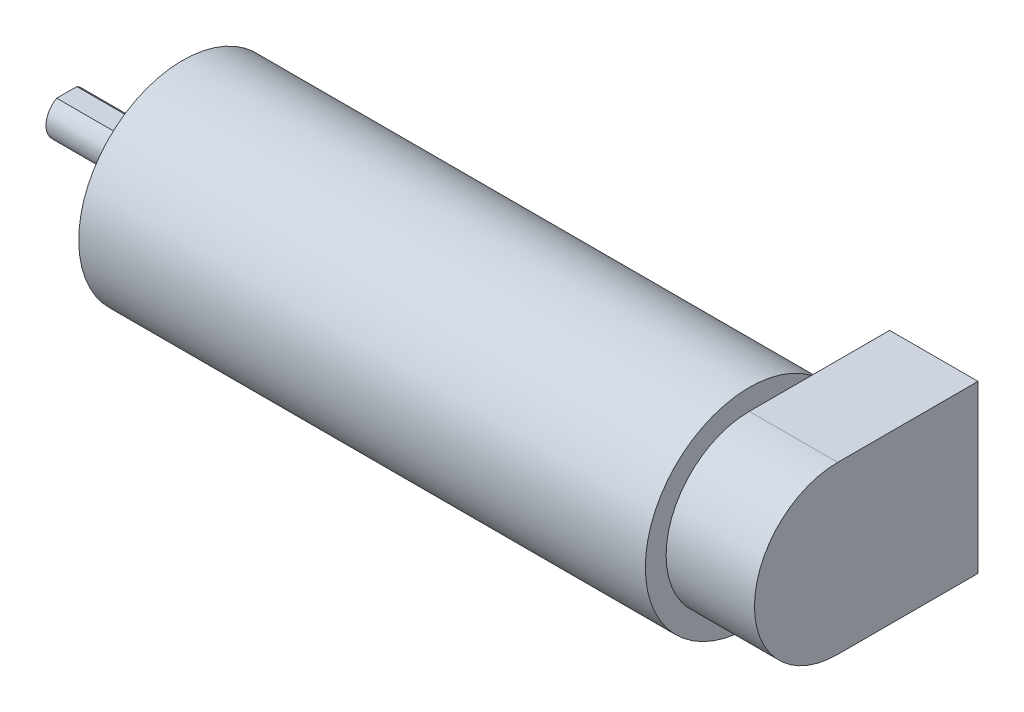
ISO-10303-21;
HEADER;
FILE_DESCRIPTION(('STEP AP214'),'2;1');
FILE_NAME('part.step','',(''),(''),'','','');
FILE_SCHEMA(('AUTOMOTIVE_DESIGN { 1 0 10303 214 1 1 1 1 }'));
ENDSEC;
DATA;
#1=APPLICATION_CONTEXT('core data for automotive mechanical design processes');
#2=APPLICATION_PROTOCOL_DEFINITION('international standard','automotive_design',2000,#1);
#3=PRODUCT_CONTEXT('',#1,'mechanical');
#4=PRODUCT('Part','Part','',(#3));
#5=PRODUCT_RELATED_PRODUCT_CATEGORY('part','',(#4));
#6=PRODUCT_DEFINITION_FORMATION('','',#4);
#7=PRODUCT_DEFINITION_CONTEXT('part definition',#1,'design');
#8=PRODUCT_DEFINITION('design','',#6,#7);
#9=PRODUCT_DEFINITION_SHAPE('','',#8);
#10=(LENGTH_UNIT() NAMED_UNIT(*) SI_UNIT(.MILLI.,.METRE.));
#11=(NAMED_UNIT(*) PLANE_ANGLE_UNIT() SI_UNIT($,.RADIAN.));
#12=(NAMED_UNIT(*) SI_UNIT($,.STERADIAN.) SOLID_ANGLE_UNIT());
#13=UNCERTAINTY_MEASURE_WITH_UNIT(LENGTH_MEASURE(1.E-05),#10,'distance_accuracy_value','');
#14=(GEOMETRIC_REPRESENTATION_CONTEXT(3) GLOBAL_UNCERTAINTY_ASSIGNED_CONTEXT((#13)) GLOBAL_UNIT_ASSIGNED_CONTEXT((#10,
#11,#12)) REPRESENTATION_CONTEXT('',''));
#15=CARTESIAN_POINT('',(0.,0.,0.));
#16=DIRECTION('',(0.,0.,1.));
#17=DIRECTION('',(1.,0.,0.));
#18=AXIS2_PLACEMENT_3D('',#15,#16,#17);
#19=CARTESIAN_POINT('',(-22.3,0.,0.));
#20=DIRECTION('',(0.999999999999999,0.,0.));
#21=DIRECTION('',(0.,0.,-0.999999999999999));
#22=AXIS2_PLACEMENT_3D('',#19,#20,#21);
#23=CYLINDRICAL_SURFACE('',#22,4.);
#24=CARTESIAN_POINT('',(-3.3,0.,0.));
#25=DIRECTION('',(-0.999999999999999,0.,0.));
#26=DIRECTION('',(0.,0.,0.999999999999999));
#27=AXIS2_PLACEMENT_3D('',#24,#25,#26);
#28=CIRCLE('',#27,4.);
#29=CARTESIAN_POINT('',(-3.3,0.,4.));
#30=VERTEX_POINT('',#29);
#31=EDGE_CURVE('E110',#30,#30,#28,.T.);
#32=ORIENTED_EDGE('',*,*,#31,.T.);
#33=EDGE_LOOP('',(#32));
#34=FACE_BOUND('',#33,.T.);
#35=DIRECTION('',(-1.,0.,0.));
#36=VECTOR('',#35,1.);
#37=CARTESIAN_POINT('',(-7.3,3.49999999999999,1.93649167310372));
#38=LINE('',#37,#36);
#39=CARTESIAN_POINT('',(-7.3,3.49999999999999,1.93649167310372));
#40=VERTEX_POINT('',#39);
#41=CARTESIAN_POINT('',(-22.3,3.49999999999999,1.93649167310372));
#42=VERTEX_POINT('',#41);
#43=EDGE_CURVE('E92',#40,#42,#38,.T.);
#44=ORIENTED_EDGE('',*,*,#43,.T.);
#45=CARTESIAN_POINT('',(-22.3,0.,0.));
#46=DIRECTION('',(-0.999999999999999,0.,0.));
#47=DIRECTION('',(0.,0.,0.999999999999999));
#48=AXIS2_PLACEMENT_3D('',#45,#46,#47);
#49=CIRCLE('',#48,4.);
#50=CARTESIAN_POINT('',(-22.3,3.50000000000001,-1.9364916731037));
#51=VERTEX_POINT('',#50);
#52=EDGE_CURVE('E112',#51,#42,#49,.T.);
#53=ORIENTED_EDGE('',*,*,#52,.F.);
#54=DIRECTION('',(-1.,0.,0.));
#55=VECTOR('',#54,1.);
#56=CARTESIAN_POINT('',(-7.3,3.50000000000001,-1.9364916731037));
#57=LINE('',#56,#55);
#58=CARTESIAN_POINT('',(-7.3,3.50000000000001,-1.9364916731037));
#59=VERTEX_POINT('',#58);
#60=EDGE_CURVE('E50',#59,#51,#57,.T.);
#61=ORIENTED_EDGE('',*,*,#60,.F.);
#62=CARTESIAN_POINT('',(-7.3,0.,0.));
#63=DIRECTION('',(-1.,0.,0.));
#64=DIRECTION('',(0.,0.,1.));
#65=AXIS2_PLACEMENT_3D('',#62,#63,#64);
#66=CIRCLE('',#65,4.);
#67=EDGE_CURVE('E102',#40,#59,#66,.T.);
#68=ORIENTED_EDGE('',*,*,#67,.F.);
#69=EDGE_LOOP('',(#44,#53,#61,#68));
#70=FACE_BOUND('',#69,.T.);
#71=ADVANCED_FACE('F35',(#34,#70),#23,.T.);
#72=CARTESIAN_POINT('',(-22.3,0.,0.));
#73=DIRECTION('',(-0.999999999999999,0.,0.));
#74=DIRECTION('',(0.,0.,0.999999999999999));
#75=AXIS2_PLACEMENT_3D('',#72,#73,#74);
#76=PLANE('',#75);
#77=ORIENTED_EDGE('',*,*,#52,.T.);
#78=DIRECTION('',(0.,0.,-1.));
#79=VECTOR('',#78,1.);
#80=CARTESIAN_POINT('',(-22.3,3.5,0.));
#81=LINE('',#80,#79);
#82=EDGE_CURVE('E97',#42,#51,#81,.T.);
#83=ORIENTED_EDGE('',*,*,#82,.T.);
#84=EDGE_LOOP('',(#77,#83));
#85=FACE_BOUND('',#84,.T.);
#86=ADVANCED_FACE('F179',(#85),#76,.T.);
#87=CARTESIAN_POINT('',(109.,-4.44089209850063E-13,0.));
#88=DIRECTION('',(-0.999999999999999,0.,0.));
#89=DIRECTION('',(0.,0.,0.999999999999999));
#90=AXIS2_PLACEMENT_3D('',#87,#88,#89);
#91=CYLINDRICAL_SURFACE('',#90,20.);
#92=CARTESIAN_POINT('',(109.,-4.44089209850063E-13,0.));
#93=DIRECTION('',(0.999999999999999,0.,0.));
#94=DIRECTION('',(0.,0.,-0.999999999999999));
#95=AXIS2_PLACEMENT_3D('',#92,#93,#94);
#96=CIRCLE('',#95,20.);
#97=CARTESIAN_POINT('',(109.,16.,-11.9999999999999));
#98=VERTEX_POINT('',#97);
#99=CARTESIAN_POINT('',(109.,-16.0000000000003,-11.9999999999999));
#100=VERTEX_POINT('',#99);
#101=EDGE_CURVE('E151',#98,#100,#96,.T.);
#102=ORIENTED_EDGE('',*,*,#101,.F.);
#103=EDGE_CURVE('E152',#100,#98,#96,.T.);
#104=ORIENTED_EDGE('',*,*,#103,.F.);
#105=EDGE_LOOP('',(#102,#104));
#106=FACE_BOUND('',#105,.T.);
#107=CARTESIAN_POINT('',(0.,0.,0.));
#108=DIRECTION('',(0.999999999999999,0.,0.));
#109=DIRECTION('',(0.,0.,-0.999999999999999));
#110=AXIS2_PLACEMENT_3D('',#107,#108,#109);
#111=CIRCLE('',#110,20.);
#112=CARTESIAN_POINT('',(0.,0.,-20.));
#113=VERTEX_POINT('',#112);
#114=EDGE_CURVE('E150',#113,#113,#111,.T.);
#115=ORIENTED_EDGE('',*,*,#114,.T.);
#116=EDGE_LOOP('',(#115));
#117=FACE_BOUND('',#116,.T.);
#118=ADVANCED_FACE('F37',(#106,#117),#91,.T.);
#119=CARTESIAN_POINT('',(109.,-4.44089209850063E-13,0.));
#120=DIRECTION('',(0.999999999999999,0.,0.));
#121=DIRECTION('',(0.,0.,-0.999999999999999));
#122=AXIS2_PLACEMENT_3D('',#119,#120,#121);
#123=PLANE('',#122);
#124=DIRECTION('',(0.,0.,0.999999999999999));
#125=VECTOR('',#124,1.);
#126=CARTESIAN_POINT('',(109.,16.,0.));
#127=LINE('',#126,#125);
#128=CARTESIAN_POINT('',(109.,16.,0.));
#129=VERTEX_POINT('',#128);
#130=EDGE_CURVE('E43',#98,#129,#127,.T.);
#131=ORIENTED_EDGE('',*,*,#130,.F.);
#132=ORIENTED_EDGE('',*,*,#101,.T.);
#133=DIRECTION('',(0.,0.,-0.999999999999999));
#134=VECTOR('',#133,1.);
#135=CARTESIAN_POINT('',(109.,-16.0000000000002,0.));
#136=LINE('',#135,#134);
#137=CARTESIAN_POINT('',(109.,-16.0000000000002,0.));
#138=VERTEX_POINT('',#137);
#139=EDGE_CURVE('E132',#138,#100,#136,.T.);
#140=ORIENTED_EDGE('',*,*,#139,.F.);
#141=CARTESIAN_POINT('',(109.,-4.44089209850063E-13,0.));
#142=DIRECTION('',(0.999999999999999,0.,0.));
#143=DIRECTION('',(0.,0.,-0.999999999999999));
#144=AXIS2_PLACEMENT_3D('',#141,#142,#143);
#145=CIRCLE('',#144,16.);
#146=EDGE_CURVE('E58',#129,#138,#145,.T.);
#147=ORIENTED_EDGE('',*,*,#146,.F.);
#148=EDGE_LOOP('',(#131,#132,#140,#147));
#149=FACE_BOUND('',#148,.T.);
#150=ADVANCED_FACE('F177',(#149),#123,.T.);
#151=CARTESIAN_POINT('',(0.,0.,0.));
#152=DIRECTION('',(0.999999999999999,0.,0.));
#153=DIRECTION('',(0.,0.,-0.999999999999999));
#154=AXIS2_PLACEMENT_3D('',#151,#152,#153);
#155=PLANE('',#154);
#156=CARTESIAN_POINT('',(0.,0.,0.));
#157=DIRECTION('',(0.999999999999999,0.,0.));
#158=DIRECTION('',(0.,0.,-0.999999999999999));
#159=AXIS2_PLACEMENT_3D('',#156,#157,#158);
#160=CIRCLE('',#159,12.5);
#161=CARTESIAN_POINT('',(0.,0.,-12.5));
#162=VERTEX_POINT('',#161);
#163=EDGE_CURVE('E11',#162,#162,#160,.F.);
#164=ORIENTED_EDGE('',*,*,#163,.F.);
#165=EDGE_LOOP('',(#164));
#166=FACE_BOUND('',#165,.T.);
#167=ORIENTED_EDGE('',*,*,#114,.F.);
#168=EDGE_LOOP('',(#167));
#169=FACE_BOUND('',#168,.T.);
#170=ADVANCED_FACE('F183',(#166,#169),#155,.F.);
#171=CARTESIAN_POINT('',(109.,-4.44089209850063E-13,0.));
#172=DIRECTION('',(0.999999999999999,0.,0.));
#173=DIRECTION('',(0.,0.,-0.999999999999999));
#174=AXIS2_PLACEMENT_3D('',#171,#172,#173);
#175=PLANE('',#174);
#176=CARTESIAN_POINT('',(109.,-16.,-27.));
#177=VERTEX_POINT('',#176);
#178=EDGE_CURVE('E131',#100,#177,#136,.T.);
#179=ORIENTED_EDGE('',*,*,#178,.F.);
#180=ORIENTED_EDGE('',*,*,#103,.T.);
#181=CARTESIAN_POINT('',(109.,16.,-26.9999999999999));
#182=VERTEX_POINT('',#181);
#183=EDGE_CURVE('E123',#182,#98,#127,.T.);
#184=ORIENTED_EDGE('',*,*,#183,.F.);
#185=DIRECTION('',(0.,1.,0.));
#186=VECTOR('',#185,1.);
#187=CARTESIAN_POINT('',(109.,16.,-26.9999999999999));
#188=LINE('',#187,#186);
#189=EDGE_CURVE('E135',#177,#182,#188,.T.);
#190=ORIENTED_EDGE('',*,*,#189,.F.);
#191=EDGE_LOOP('',(#179,#180,#184,#190));
#192=FACE_BOUND('',#191,.T.);
#193=ADVANCED_FACE('F161',(#192),#175,.F.);
#194=CARTESIAN_POINT('',(126.,-4.44089209850063E-13,0.));
#195=DIRECTION('',(-0.999999999999999,0.,0.));
#196=DIRECTION('',(0.,0.,0.999999999999999));
#197=AXIS2_PLACEMENT_3D('',#194,#195,#196);
#198=CYLINDRICAL_SURFACE('',#197,16.);
#199=ORIENTED_EDGE('',*,*,#146,.T.);
#200=DIRECTION('',(-0.999999999999999,0.,0.));
#201=VECTOR('',#200,1.);
#202=CARTESIAN_POINT('',(126.,-16.0000000000002,0.));
#203=LINE('',#202,#201);
#204=CARTESIAN_POINT('',(126.,-16.0000000000002,0.));
#205=VERTEX_POINT('',#204);
#206=EDGE_CURVE('E147',#205,#138,#203,.T.);
#207=ORIENTED_EDGE('',*,*,#206,.F.);
#208=CARTESIAN_POINT('',(126.,-4.44089209850063E-13,0.));
#209=DIRECTION('',(0.999999999999999,0.,0.));
#210=DIRECTION('',(0.,0.,-0.999999999999999));
#211=AXIS2_PLACEMENT_3D('',#208,#209,#210);
#212=CIRCLE('',#211,16.);
#213=CARTESIAN_POINT('',(126.,15.9999999999996,0.));
#214=VERTEX_POINT('',#213);
#215=EDGE_CURVE('E119',#214,#205,#212,.T.);
#216=ORIENTED_EDGE('',*,*,#215,.F.);
#217=DIRECTION('',(-0.999999999999999,0.,0.));
#218=VECTOR('',#217,1.);
#219=CARTESIAN_POINT('',(126.,15.9999999999996,0.));
#220=LINE('',#219,#218);
#221=EDGE_CURVE('E129',#214,#129,#220,.T.);
#222=ORIENTED_EDGE('',*,*,#221,.T.);
#223=EDGE_LOOP('',(#199,#207,#216,#222));
#224=FACE_BOUND('',#223,.T.);
#225=ADVANCED_FACE('F210',(#224),#198,.T.);
#226=CARTESIAN_POINT('',(126.,-16.0000000000002,0.));
#227=DIRECTION('',(0.,1.,0.));
#228=DIRECTION('',(0.,0.,0.999999999999999));
#229=AXIS2_PLACEMENT_3D('',#226,#227,#228);
#230=PLANE('',#229);
#231=ORIENTED_EDGE('',*,*,#139,.T.);
#232=ORIENTED_EDGE('',*,*,#178,.T.);
#233=DIRECTION('',(-0.999999999999999,0.,0.));
#234=VECTOR('',#233,1.);
#235=CARTESIAN_POINT('',(126.,-16.,-27.));
#236=LINE('',#235,#234);
#237=CARTESIAN_POINT('',(126.,-16.,-27.));
#238=VERTEX_POINT('',#237);
#239=EDGE_CURVE('E144',#238,#177,#236,.T.);
#240=ORIENTED_EDGE('',*,*,#239,.F.);
#241=DIRECTION('',(0.,0.,-0.999999999999999));
#242=VECTOR('',#241,1.);
#243=CARTESIAN_POINT('',(126.,-16.0000000000002,0.));
#244=LINE('',#243,#242);
#245=EDGE_CURVE('E122',#205,#238,#244,.T.);
#246=ORIENTED_EDGE('',*,*,#245,.F.);
#247=ORIENTED_EDGE('',*,*,#206,.T.);
#248=EDGE_LOOP('',(#231,#232,#240,#246,#247));
#249=FACE_BOUND('',#248,.T.);
#250=ADVANCED_FACE('F175',(#249),#230,.F.);
#251=CARTESIAN_POINT('',(126.,15.9999999999999,-26.9999999999999));
#252=DIRECTION('',(0.,0.,0.999999999999999));
#253=DIRECTION('',(0.,-1.,0.));
#254=AXIS2_PLACEMENT_3D('',#251,#252,#253);
#255=PLANE('',#254);
#256=ORIENTED_EDGE('',*,*,#189,.T.);
#257=DIRECTION('',(-0.999999999999999,0.,0.));
#258=VECTOR('',#257,1.);
#259=CARTESIAN_POINT('',(126.,15.9999999999999,-26.9999999999999));
#260=LINE('',#259,#258);
#261=CARTESIAN_POINT('',(126.,15.9999999999999,-26.9999999999999));
#262=VERTEX_POINT('',#261);
#263=EDGE_CURVE('E141',#262,#182,#260,.T.);
#264=ORIENTED_EDGE('',*,*,#263,.F.);
#265=DIRECTION('',(0.,1.,0.));
#266=VECTOR('',#265,1.);
#267=CARTESIAN_POINT('',(126.,15.9999999999999,-26.9999999999999));
#268=LINE('',#267,#266);
#269=EDGE_CURVE('E125',#238,#262,#268,.T.);
#270=ORIENTED_EDGE('',*,*,#269,.F.);
#271=ORIENTED_EDGE('',*,*,#239,.T.);
#272=EDGE_LOOP('',(#256,#264,#270,#271));
#273=FACE_BOUND('',#272,.T.);
#274=ADVANCED_FACE('F172',(#273),#255,.F.);
#275=CARTESIAN_POINT('',(126.,15.9999999999996,0.));
#276=DIRECTION('',(0.,-1.,0.));
#277=DIRECTION('',(0.,0.,-0.999999999999999));
#278=AXIS2_PLACEMENT_3D('',#275,#276,#277);
#279=PLANE('',#278);
#280=ORIENTED_EDGE('',*,*,#183,.T.);
#281=ORIENTED_EDGE('',*,*,#130,.T.);
#282=ORIENTED_EDGE('',*,*,#221,.F.);
#283=DIRECTION('',(0.,0.,0.999999999999999));
#284=VECTOR('',#283,1.);
#285=CARTESIAN_POINT('',(126.,15.9999999999996,0.));
#286=LINE('',#285,#284);
#287=EDGE_CURVE('E127',#262,#214,#286,.T.);
#288=ORIENTED_EDGE('',*,*,#287,.F.);
#289=ORIENTED_EDGE('',*,*,#263,.T.);
#290=EDGE_LOOP('',(#280,#281,#282,#288,#289));
#291=FACE_BOUND('',#290,.T.);
#292=ADVANCED_FACE('F166',(#291),#279,.F.);
#293=CARTESIAN_POINT('',(126.,-4.44089209850063E-13,0.));
#294=DIRECTION('',(0.999999999999999,0.,0.));
#295=DIRECTION('',(0.,0.,-0.999999999999999));
#296=AXIS2_PLACEMENT_3D('',#293,#294,#295);
#297=PLANE('',#296);
#298=ORIENTED_EDGE('',*,*,#215,.T.);
#299=ORIENTED_EDGE('',*,*,#245,.T.);
#300=ORIENTED_EDGE('',*,*,#269,.T.);
#301=ORIENTED_EDGE('',*,*,#287,.T.);
#302=EDGE_LOOP('',(#298,#299,#300,#301));
#303=FACE_BOUND('',#302,.T.);
#304=ADVANCED_FACE('F203',(#303),#297,.T.);
#305=CARTESIAN_POINT('',(-3.3,0.,0.));
#306=DIRECTION('',(0.999999999999999,0.,0.));
#307=DIRECTION('',(0.,0.,-0.999999999999999));
#308=AXIS2_PLACEMENT_3D('',#305,#306,#307);
#309=CYLINDRICAL_SURFACE('',#308,12.5);
#310=CARTESIAN_POINT('',(-3.3,0.,0.));
#311=DIRECTION('',(-0.999999999999999,0.,0.));
#312=DIRECTION('',(0.,0.,0.999999999999999));
#313=AXIS2_PLACEMENT_3D('',#310,#311,#312);
#314=CIRCLE('',#313,12.5);
#315=CARTESIAN_POINT('',(-3.3,0.,-12.5));
#316=VERTEX_POINT('',#315);
#317=EDGE_CURVE('E114',#316,#316,#314,.T.);
#318=CARTESIAN_POINT('',(-3.3,0.,-12.5));
#319=CARTESIAN_POINT('',(-3.265625,0.,-12.5));
#320=CARTESIAN_POINT('',(-3.23125,0.,-12.5));
#321=CARTESIAN_POINT('',(-3.1625,0.,-12.5));
#322=CARTESIAN_POINT('',(-3.128125,0.,-12.5));
#323=CARTESIAN_POINT('',(-3.059375,0.,-12.5));
#324=CARTESIAN_POINT('',(-3.025,0.,-12.5));
#325=CARTESIAN_POINT('',(-2.95625,0.,-12.5));
#326=CARTESIAN_POINT('',(-2.921875,0.,-12.5));
#327=CARTESIAN_POINT('',(-2.853125,0.,-12.5));
#328=CARTESIAN_POINT('',(-2.81875,0.,-12.5));
#329=CARTESIAN_POINT('',(-2.75,0.,-12.5));
#330=CARTESIAN_POINT('',(-2.715625,0.,-12.5));
#331=CARTESIAN_POINT('',(-2.646875,0.,-12.5));
#332=CARTESIAN_POINT('',(-2.6125,0.,-12.5));
#333=CARTESIAN_POINT('',(-2.54375,0.,-12.5));
#334=CARTESIAN_POINT('',(-2.509375,0.,-12.5));
#335=CARTESIAN_POINT('',(-2.440625,0.,-12.5));
#336=CARTESIAN_POINT('',(-2.40625,0.,-12.5));
#337=CARTESIAN_POINT('',(-2.3375,0.,-12.5));
#338=CARTESIAN_POINT('',(-2.303125,0.,-12.5));
#339=CARTESIAN_POINT('',(-2.234375,0.,-12.5));
#340=CARTESIAN_POINT('',(-2.2,0.,-12.5));
#341=CARTESIAN_POINT('',(-2.13125,0.,-12.5));
#342=CARTESIAN_POINT('',(-2.096875,0.,-12.5));
#343=CARTESIAN_POINT('',(-2.028125,0.,-12.5));
#344=CARTESIAN_POINT('',(-1.99375,0.,-12.5));
#345=CARTESIAN_POINT('',(-1.925,0.,-12.5));
#346=CARTESIAN_POINT('',(-1.890625,0.,-12.5));
#347=CARTESIAN_POINT('',(-1.821875,0.,-12.5));
#348=CARTESIAN_POINT('',(-1.7875,0.,-12.5));
#349=CARTESIAN_POINT('',(-1.71875,0.,-12.5));
#350=CARTESIAN_POINT('',(-1.684375,0.,-12.5));
#351=CARTESIAN_POINT('',(-1.615625,0.,-12.5));
#352=CARTESIAN_POINT('',(-1.58125,0.,-12.5));
#353=CARTESIAN_POINT('',(-1.5125,0.,-12.5));
#354=CARTESIAN_POINT('',(-1.478125,0.,-12.5));
#355=CARTESIAN_POINT('',(-1.409375,0.,-12.5));
#356=CARTESIAN_POINT('',(-1.375,0.,-12.5));
#357=CARTESIAN_POINT('',(-1.30625,0.,-12.5));
#358=CARTESIAN_POINT('',(-1.271875,0.,-12.5));
#359=CARTESIAN_POINT('',(-1.203125,0.,-12.5));
#360=CARTESIAN_POINT('',(-1.16875,0.,-12.5));
#361=CARTESIAN_POINT('',(-1.1,0.,-12.5));
#362=CARTESIAN_POINT('',(-1.065625,0.,-12.5));
#363=CARTESIAN_POINT('',(-0.996874999999999,0.,-12.5));
#364=CARTESIAN_POINT('',(-0.962499999999999,0.,-12.5));
#365=CARTESIAN_POINT('',(-0.893749999999999,0.,-12.5));
#366=CARTESIAN_POINT('',(-0.859374999999999,0.,-12.5));
#367=CARTESIAN_POINT('',(-0.790624999999999,0.,-12.5));
#368=CARTESIAN_POINT('',(-0.756249999999999,0.,-12.5));
#369=CARTESIAN_POINT('',(-0.687499999999999,0.,-12.5));
#370=CARTESIAN_POINT('',(-0.653124999999999,0.,-12.5));
#371=CARTESIAN_POINT('',(-0.584374999999999,0.,-12.5));
#372=CARTESIAN_POINT('',(-0.549999999999999,0.,-12.5));
#373=CARTESIAN_POINT('',(-0.481249999999999,0.,-12.5));
#374=CARTESIAN_POINT('',(-0.446874999999999,0.,-12.5));
#375=CARTESIAN_POINT('',(-0.378124999999999,0.,-12.5));
#376=CARTESIAN_POINT('',(-0.343749999999999,0.,-12.5));
#377=CARTESIAN_POINT('',(-0.274999999999999,0.,-12.5));
#378=CARTESIAN_POINT('',(-0.240624999999999,0.,-12.5));
#379=CARTESIAN_POINT('',(-0.171874999999999,0.,-12.5));
#380=CARTESIAN_POINT('',(-0.137499999999999,0.,-12.5));
#381=CARTESIAN_POINT('',(-0.0687499999999995,0.,-12.5));
#382=CARTESIAN_POINT('',(-0.0343749999999996,0.,-12.5));
#383=CARTESIAN_POINT('',(0.,0.,-12.5));
#384=B_SPLINE_CURVE_WITH_KNOTS('',3,(#318,#319,#320,#321,#322,#323,#324,#325,#326,#327,#328,
#329,#330,#331,#332,#333,#334,#335,#336,#337,#338,#339,#340,#341,#342,#343,#344,#345,#346,#347,
#348,#349,#350,#351,#352,#353,#354,#355,#356,#357,#358,#359,#360,#361,#362,#363,#364,#365,#366,
#367,#368,#369,#370,#371,#372,#373,#374,#375,#376,#377,#378,#379,#380,#381,#382,#383),
.UNSPECIFIED.,.F.,.F.,(4,2,2,2,2,2,2,2,2,2,2,2,2,2,2,2,2,2,2,2,2,2,2,2,2,2,2,2,2,2,2,2,4),(0.,
0.103124999999999,0.206249999999999,0.309374999999999,0.412499999999999,0.515624999999999,
0.618749999999999,0.721874999999999,0.824999999999999,0.928124999999999,1.03125,1.134375,1.2375,
1.340625,1.44375,1.546875,1.65,1.753125,1.85625,1.959375,2.0625,2.165625,2.26875,2.371875,2.475,
2.578125,2.68125,2.784375,2.8875,2.990625,3.09375,3.196875,3.3),.UNSPECIFIED.);
#385=EDGE_CURVE('BSEAM199',#316,#162,#384,.T.);
#386=ORIENTED_EDGE('',*,*,#317,.F.);
#387=ORIENTED_EDGE('',*,*,#163,.T.);
#388=ORIENTED_EDGE('',*,*,#385,.T.);
#389=ORIENTED_EDGE('',*,*,#385,.F.);
#390=EDGE_LOOP('',(#386,#388,#387,#389));
#391=FACE_BOUND('',#390,.T.);
#392=ADVANCED_FACE('F199',(#391),#309,.T.);
#393=CARTESIAN_POINT('',(-3.3,0.,0.));
#394=DIRECTION('',(-0.999999999999999,0.,0.));
#395=DIRECTION('',(0.,0.,0.999999999999999));
#396=AXIS2_PLACEMENT_3D('',#393,#394,#395);
#397=PLANE('',#396);
#398=ORIENTED_EDGE('',*,*,#31,.F.);
#399=EDGE_LOOP('',(#398));
#400=FACE_BOUND('',#399,.T.);
#401=ORIENTED_EDGE('',*,*,#317,.T.);
#402=EDGE_LOOP('',(#401));
#403=FACE_BOUND('',#402,.T.);
#404=ADVANCED_FACE('F196',(#400,#403),#397,.T.);
#405=CARTESIAN_POINT('',(-7.3,3.5,0.));
#406=DIRECTION('',(0.,1.,0.));
#407=DIRECTION('',(0.,0.,1.));
#408=AXIS2_PLACEMENT_3D('',#405,#406,#407);
#409=PLANE('',#408);
#410=ORIENTED_EDGE('',*,*,#82,.F.);
#411=ORIENTED_EDGE('',*,*,#43,.F.);
#412=DIRECTION('',(0.,0.,-1.));
#413=VECTOR('',#412,1.);
#414=CARTESIAN_POINT('',(-7.3,3.5,0.));
#415=LINE('',#414,#413);
#416=EDGE_CURVE('E95',#40,#59,#415,.T.);
#417=ORIENTED_EDGE('',*,*,#416,.T.);
#418=ORIENTED_EDGE('',*,*,#60,.T.);
#419=EDGE_LOOP('',(#410,#411,#417,#418));
#420=FACE_BOUND('',#419,.T.);
#421=ADVANCED_FACE('F94',(#420),#409,.T.);
#422=CARTESIAN_POINT('',(-7.3,0.,0.));
#423=DIRECTION('',(-1.,0.,0.));
#424=DIRECTION('',(0.,0.,1.));
#425=AXIS2_PLACEMENT_3D('',#422,#423,#424);
#426=PLANE('',#425);
#427=ORIENTED_EDGE('',*,*,#416,.F.);
#428=ORIENTED_EDGE('',*,*,#67,.T.);
#429=EDGE_LOOP('',(#427,#428));
#430=FACE_BOUND('',#429,.T.);
#431=ADVANCED_FACE('F105',(#430),#426,.T.);
#432=CLOSED_SHELL('',(#71,#86,#118,#150,#170,#193,#225,#250,#274,#292,#304,#392,#404,#421,#431));
#433=MANIFOLD_SOLID_BREP('B2',#432);
#434=ADVANCED_BREP_SHAPE_REPRESENTATION('',(#18,#433),#14);
#435=SHAPE_DEFINITION_REPRESENTATION(#9,#434);
ENDSEC;
END-ISO-10303-21;
